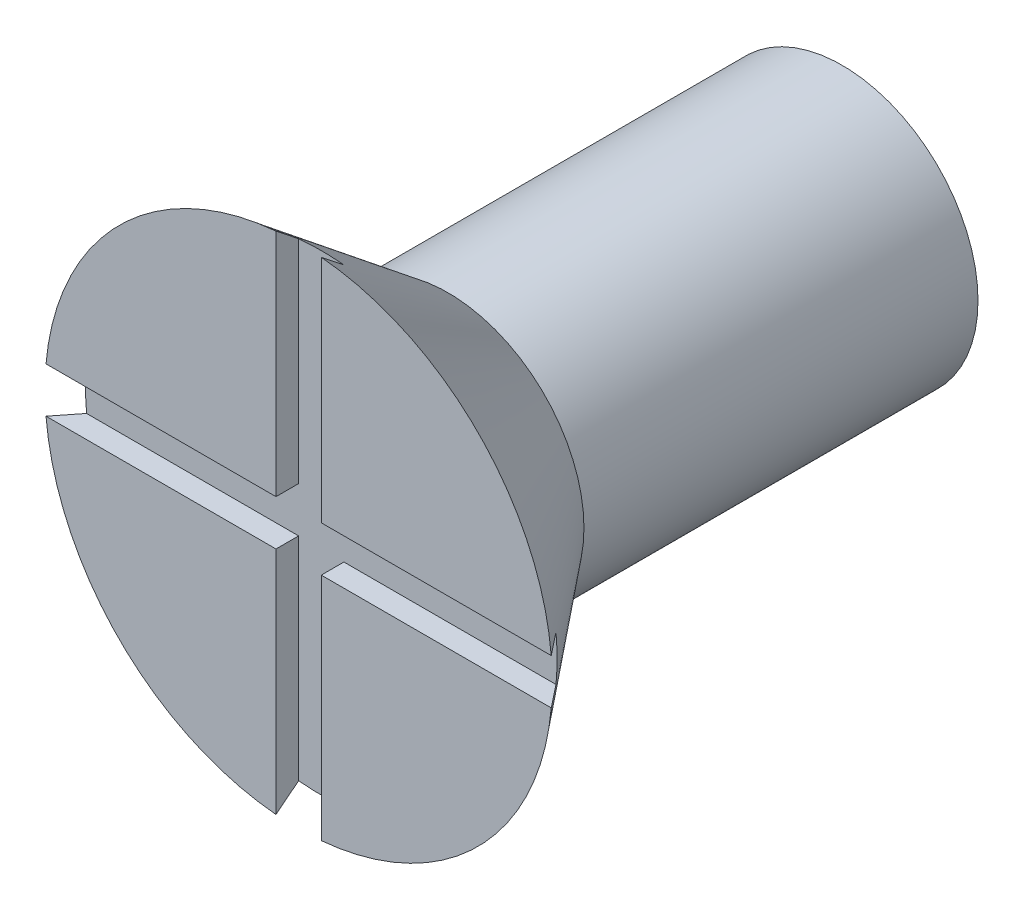
ISO-10303-21;
HEADER;
FILE_DESCRIPTION(('STEP AP214'),'2;1');
FILE_NAME('part.step','',(''),(''),'','','');
FILE_SCHEMA(('AUTOMOTIVE_DESIGN { 1 0 10303 214 1 1 1 1 }'));
ENDSEC;
DATA;
#1=APPLICATION_CONTEXT('core data for automotive mechanical design processes');
#2=APPLICATION_PROTOCOL_DEFINITION('international standard','automotive_design',2000,#1);
#3=PRODUCT_CONTEXT('',#1,'mechanical');
#4=PRODUCT('Part','Part','',(#3));
#5=PRODUCT_RELATED_PRODUCT_CATEGORY('part','',(#4));
#6=PRODUCT_DEFINITION_FORMATION('','',#4);
#7=PRODUCT_DEFINITION_CONTEXT('part definition',#1,'design');
#8=PRODUCT_DEFINITION('design','',#6,#7);
#9=PRODUCT_DEFINITION_SHAPE('','',#8);
#10=(LENGTH_UNIT() NAMED_UNIT(*) SI_UNIT(.MILLI.,.METRE.));
#11=(NAMED_UNIT(*) PLANE_ANGLE_UNIT() SI_UNIT($,.RADIAN.));
#12=(NAMED_UNIT(*) SI_UNIT($,.STERADIAN.) SOLID_ANGLE_UNIT());
#13=UNCERTAINTY_MEASURE_WITH_UNIT(LENGTH_MEASURE(1.E-05),#10,'distance_accuracy_value','');
#14=(GEOMETRIC_REPRESENTATION_CONTEXT(3) GLOBAL_UNCERTAINTY_ASSIGNED_CONTEXT((#13)) GLOBAL_UNIT_ASSIGNED_CONTEXT((#10,
#11,#12)) REPRESENTATION_CONTEXT('',''));
#15=CARTESIAN_POINT('',(0.,0.,0.));
#16=DIRECTION('',(0.,0.,1.));
#17=DIRECTION('',(1.,0.,0.));
#18=AXIS2_PLACEMENT_3D('',#15,#16,#17);
#19=CARTESIAN_POINT('',(0.,0.,0.));
#20=DIRECTION('',(0.,0.,-1.));
#21=DIRECTION('',(-1.,0.,0.));
#22=AXIS2_PLACEMENT_3D('',#19,#20,#21);
#23=PLANE('',#22);
#24=DIRECTION('',(1.,0.,0.));
#25=VECTOR('',#24,1.);
#26=CARTESIAN_POINT('',(0.,0.25,0.));
#27=LINE('',#26,#25);
#28=CARTESIAN_POINT('',(-2.78881695347687,0.25,0.));
#29=VERTEX_POINT('',#28);
#30=CARTESIAN_POINT('',(-0.25,0.25,0.));
#31=VERTEX_POINT('',#30);
#32=EDGE_CURVE('E175',#29,#31,#27,.T.);
#33=ORIENTED_EDGE('',*,*,#32,.T.);
#34=DIRECTION('',(0.,-1.,0.));
#35=VECTOR('',#34,1.);
#36=CARTESIAN_POINT('',(-0.25,-6.30142135623731,0.));
#37=LINE('',#36,#35);
#38=CARTESIAN_POINT('',(-0.25,2.78881695347687,0.));
#39=VERTEX_POINT('',#38);
#40=EDGE_CURVE('E172',#39,#31,#37,.T.);
#41=ORIENTED_EDGE('',*,*,#40,.F.);
#42=CARTESIAN_POINT('',(0.,0.,0.));
#43=DIRECTION('',(0.,0.,1.));
#44=DIRECTION('',(1.,0.,0.));
#45=AXIS2_PLACEMENT_3D('',#42,#43,#44);
#46=CIRCLE('',#45,2.8);
#47=EDGE_CURVE('E197',#39,#29,#46,.T.);
#48=ORIENTED_EDGE('',*,*,#47,.T.);
#49=EDGE_LOOP('',(#33,#41,#48));
#50=FACE_BOUND('',#49,.T.);
#51=ADVANCED_FACE('F34',(#50),#23,.F.);
#52=DIRECTION('',(0.,-1.,0.));
#53=VECTOR('',#52,1.);
#54=CARTESIAN_POINT('',(0.25,-6.30142135623731,0.));
#55=LINE('',#54,#53);
#56=CARTESIAN_POINT('',(0.25,2.78881695347687,0.));
#57=VERTEX_POINT('',#56);
#58=CARTESIAN_POINT('',(0.25,0.25,0.));
#59=VERTEX_POINT('',#58);
#60=EDGE_CURVE('E169',#57,#59,#55,.T.);
#61=ORIENTED_EDGE('',*,*,#60,.T.);
#62=DIRECTION('',(1.,0.,0.));
#63=VECTOR('',#62,1.);
#64=CARTESIAN_POINT('',(0.,0.25,0.));
#65=LINE('',#64,#63);
#66=CARTESIAN_POINT('',(2.78881695347687,0.25,0.));
#67=VERTEX_POINT('',#66);
#68=EDGE_CURVE('E166',#59,#67,#65,.T.);
#69=ORIENTED_EDGE('',*,*,#68,.T.);
#70=EDGE_CURVE('E194',#67,#57,#46,.T.);
#71=ORIENTED_EDGE('',*,*,#70,.T.);
#72=EDGE_LOOP('',(#61,#69,#71));
#73=FACE_BOUND('',#72,.T.);
#74=ADVANCED_FACE('F288',(#73),#23,.F.);
#75=DIRECTION('',(0.,-1.,0.));
#76=VECTOR('',#75,1.);
#77=CARTESIAN_POINT('',(0.25,-6.30142135623731,0.));
#78=LINE('',#77,#76);
#79=CARTESIAN_POINT('',(0.25,-0.25,0.));
#80=VERTEX_POINT('',#79);
#81=CARTESIAN_POINT('',(0.25,-2.78881695347687,0.));
#82=VERTEX_POINT('',#81);
#83=EDGE_CURVE('E134',#80,#82,#78,.T.);
#84=ORIENTED_EDGE('',*,*,#83,.T.);
#85=CARTESIAN_POINT('',(2.78881695347687,-0.25,0.));
#86=VERTEX_POINT('',#85);
#87=EDGE_CURVE('E193',#82,#86,#46,.T.);
#88=ORIENTED_EDGE('',*,*,#87,.T.);
#89=DIRECTION('',(1.,0.,0.));
#90=VECTOR('',#89,1.);
#91=CARTESIAN_POINT('',(0.,-0.25,0.));
#92=LINE('',#91,#90);
#93=EDGE_CURVE('E164',#80,#86,#92,.T.);
#94=ORIENTED_EDGE('',*,*,#93,.F.);
#95=EDGE_LOOP('',(#84,#88,#94));
#96=FACE_BOUND('',#95,.T.);
#97=ADVANCED_FACE('F308',(#96),#23,.F.);
#98=CARTESIAN_POINT('',(0.,0.,-1.65));
#99=DIRECTION('',(0.,0.,1.));
#100=DIRECTION('',(1.,0.,0.));
#101=AXIS2_PLACEMENT_3D('',#98,#99,#100);
#102=CONICAL_SURFACE('',#101,1.5,0.667306134978355);
#103=CARTESIAN_POINT('',(0.,0.,-1.65));
#104=DIRECTION('',(0.,0.,1.));
#105=DIRECTION('',(1.,0.,0.));
#106=AXIS2_PLACEMENT_3D('',#103,#104,#105);
#107=CIRCLE('',#106,1.5);
#108=CARTESIAN_POINT('',(1.5,0.,-1.65));
#109=VERTEX_POINT('',#108);
#110=EDGE_CURVE('E190',#109,#109,#107,.T.);
#111=ORIENTED_EDGE('',*,*,#110,.T.);
#112=EDGE_LOOP('',(#111));
#113=FACE_BOUND('',#112,.T.);
#114=ORIENTED_EDGE('',*,*,#47,.F.);
#115=CARTESIAN_POINT('',(-0.25,4.61040311921455,2.30641606433277));
#116=CARTESIAN_POINT('',(-0.25,4.44346195722325,2.0948429538878));
#117=CARTESIAN_POINT('',(-0.25,4.27650709341861,1.88328064952671));
#118=CARTESIAN_POINT('',(-0.25,3.94255134450841,1.46019424557198));
#119=CARTESIAN_POINT('',(-0.25,3.77555045965949,1.24867014577575));
#120=CARTESIAN_POINT('',(-0.25,3.44148518754161,0.825678179662706));
#121=CARTESIAN_POINT('',(-0.25,3.27442080145119,0.614210312415257));
#122=CARTESIAN_POINT('',(-0.25,2.94018648593002,0.191356170498895));
#123=CARTESIAN_POINT('',(-0.25,2.77301655594174,-0.0200301037293367));
#124=CARTESIAN_POINT('',(-0.25,2.43849855264865,-0.442673667390637));
#125=CARTESIAN_POINT('',(-0.25,2.27115047336071,-0.653930952090944));
#126=CARTESIAN_POINT('',(-0.25,2.01988138234541,-0.97061823218805));
#127=CARTESIAN_POINT('',(-0.25,1.93608452057686,-1.07614671698217));
#128=CARTESIAN_POINT('',(-0.25,1.76836741455764,-1.28710662423912));
#129=CARTESIAN_POINT('',(-0.25,1.68444716960416,-1.39253804614346));
#130=CARTESIAN_POINT('',(-0.25,1.51641370214706,-1.60325589296984));
#131=CARTESIAN_POINT('',(-0.25,1.4323004699463,-1.70854231016065));
#132=CARTESIAN_POINT('',(-0.25,1.26376822273576,-1.91886775746895));
#133=CARTESIAN_POINT('',(-0.25,1.17934921270972,-2.0239067915728));
#134=CARTESIAN_POINT('',(-0.25,1.05228987763816,-2.18112359389158));
#135=CARTESIAN_POINT('',(-0.25,1.00986345951116,-2.23347407582134));
#136=CARTESIAN_POINT('',(-0.25,0.92480036738101,-2.3380029174993));
#137=CARTESIAN_POINT('',(-0.25,0.882163695818334,-2.39018127923368));
#138=CARTESIAN_POINT('',(-0.25,0.796584348793626,-2.49429292306812));
#139=CARTESIAN_POINT('',(-0.25,0.753641654688421,-2.54622618991081));
#140=CARTESIAN_POINT('',(-0.25,0.667227301357165,-2.64965376649044));
#141=CARTESIAN_POINT('',(-0.25,0.623755620214092,-2.70114805788837));
#142=CARTESIAN_POINT('',(-0.25,0.579908440244512,-2.75232536636958));
#143=B_SPLINE_CURVE_WITH_KNOTS('',3,(#115,#116,#117,#118,#119,#120,#121,#122,#123,#124,#125,
#126,#127,#128,#129,#130,#131,#132,#133,#134,#135,#136,#137,#138,#139,#140,#141,#142),
.UNSPECIFIED.,.F.,.F.,(4,2,2,2,2,2,2,2,2,2,2,2,2,4),(0.,0.808512709901789,1.61702099865428,
2.42551495078849,3.23401321013757,4.04253953823131,4.44679630595397,4.85105538539298,
5.25533524335092,5.6596085415139,5.86175944247296,6.06390800251276,6.26606898473887,
6.46823837162429),.UNSPECIFIED.);
#144=CARTESIAN_POINT('',(-0.25,2.59099725173417,-0.25));
#145=VERTEX_POINT('',#144);
#146=EDGE_CURVE('E11',#39,#145,#143,.T.);
#147=ORIENTED_EDGE('',*,*,#146,.T.);
#148=CARTESIAN_POINT('',(0.,0.,-0.25));
#149=DIRECTION('',(0.,0.,1.));
#150=DIRECTION('',(1.,0.,0.));
#151=AXIS2_PLACEMENT_3D('',#148,#149,#150);
#152=CIRCLE('',#151,2.6030303030303);
#153=CARTESIAN_POINT('',(0.25,2.59099725173417,-0.25));
#154=VERTEX_POINT('',#153);
#155=EDGE_CURVE('E199',#154,#145,#152,.T.);
#156=ORIENTED_EDGE('',*,*,#155,.F.);
#157=CARTESIAN_POINT('',(0.25,4.61040311921455,2.30641606433277));
#158=CARTESIAN_POINT('',(0.25,4.44346195722325,2.0948429538878));
#159=CARTESIAN_POINT('',(0.25,4.27650709341861,1.88328064952671));
#160=CARTESIAN_POINT('',(0.25,3.94255134450841,1.46019424557198));
#161=CARTESIAN_POINT('',(0.25,3.77555045965949,1.24867014577575));
#162=CARTESIAN_POINT('',(0.25,3.44148518754161,0.825678179662706));
#163=CARTESIAN_POINT('',(0.25,3.27442080145119,0.614210312415257));
#164=CARTESIAN_POINT('',(0.25,2.94018648593002,0.191356170498895));
#165=CARTESIAN_POINT('',(0.25,2.77301655594174,-0.0200301037293367));
#166=CARTESIAN_POINT('',(0.25,2.43849855264865,-0.442673667390637));
#167=CARTESIAN_POINT('',(0.25,2.27115047336071,-0.653930952090944));
#168=CARTESIAN_POINT('',(0.25,2.01988138234541,-0.97061823218805));
#169=CARTESIAN_POINT('',(0.25,1.93608452057686,-1.07614671698217));
#170=CARTESIAN_POINT('',(0.25,1.76836741455764,-1.28710662423912));
#171=CARTESIAN_POINT('',(0.25,1.68444716960416,-1.39253804614346));
#172=CARTESIAN_POINT('',(0.25,1.51641370214706,-1.60325589296984));
#173=CARTESIAN_POINT('',(0.25,1.4323004699463,-1.70854231016065));
#174=CARTESIAN_POINT('',(0.25,1.26376822273576,-1.91886775746895));
#175=CARTESIAN_POINT('',(0.25,1.17934921270972,-2.0239067915728));
#176=CARTESIAN_POINT('',(0.25,1.05228987763816,-2.18112359389158));
#177=CARTESIAN_POINT('',(0.25,1.00986345951116,-2.23347407582134));
#178=CARTESIAN_POINT('',(0.25,0.92480036738101,-2.3380029174993));
#179=CARTESIAN_POINT('',(0.25,0.882163695818334,-2.39018127923368));
#180=CARTESIAN_POINT('',(0.25,0.796584348793626,-2.49429292306812));
#181=CARTESIAN_POINT('',(0.25,0.753641654688421,-2.54622618991081));
#182=CARTESIAN_POINT('',(0.25,0.667227301357165,-2.64965376649044));
#183=CARTESIAN_POINT('',(0.25,0.623755620214092,-2.70114805788837));
#184=CARTESIAN_POINT('',(0.25,0.579908440244512,-2.75232536636958));
#185=B_SPLINE_CURVE_WITH_KNOTS('',3,(#157,#158,#159,#160,#161,#162,#163,#164,#165,#166,#167,
#168,#169,#170,#171,#172,#173,#174,#175,#176,#177,#178,#179,#180,#181,#182,#183,#184),
.UNSPECIFIED.,.F.,.F.,(4,2,2,2,2,2,2,2,2,2,2,2,2,4),(0.,0.808512709901789,1.61702099865428,
2.42551495078849,3.23401321013757,4.04253953823131,4.44679630595397,4.85105538539298,
5.25533524335092,5.6596085415139,5.86175944247296,6.06390800251276,6.26606898473887,
6.46823837162429),.UNSPECIFIED.);
#186=EDGE_CURVE('E47',#57,#154,#185,.T.);
#187=ORIENTED_EDGE('',*,*,#186,.F.);
#188=ORIENTED_EDGE('',*,*,#70,.F.);
#189=CARTESIAN_POINT('',(0.579908440244512,0.25,-2.75232536636958));
#190=CARTESIAN_POINT('',(0.622223902543749,0.25,-2.70294133405472));
#191=CARTESIAN_POINT('',(0.664186326603089,0.25,-2.6532590896929));
#192=CARTESIAN_POINT('',(0.747610336936358,0.25,-2.55347895321281));
#193=CARTESIAN_POINT('',(0.789071944911312,0.25,-2.50338107926415));
#194=CARTESIAN_POINT('',(0.871700764541476,0.25,-2.40294910136923));
#195=CARTESIAN_POINT('',(0.912867993449845,0.25,-2.35261501155845));
#196=CARTESIAN_POINT('',(0.994997507765702,0.25,-2.2517787653431));
#197=CARTESIAN_POINT('',(1.03595979039282,0.25,-2.20127660667386));
#198=CARTESIAN_POINT('',(1.2054534374206,0.25,-1.99173767460425));
#199=CARTESIAN_POINT('',(1.33338451483848,0.25,-1.83221596540128));
#200=CARTESIAN_POINT('',(1.58871778630435,0.25,-1.51275147375573));
#201=CARTESIAN_POINT('',(1.7161199800947,0.25,-1.35280869110807));
#202=CARTESIAN_POINT('',(1.97065095405093,0.25,-1.03268330437289));
#203=CARTESIAN_POINT('',(2.09777970998038,0.25,-0.872500681001518));
#204=CARTESIAN_POINT('',(2.35187604577092,0.25,-0.552008167591453));
#205=CARTESIAN_POINT('',(2.47884362587265,0.25,-0.391698277743345));
#206=CARTESIAN_POINT('',(2.7730302315297,0.25,-0.0200151894947959));
#207=CARTESIAN_POINT('',(2.94021185622354,0.25,0.191387614041437));
#208=CARTESIAN_POINT('',(3.27447158883412,0.25,0.614275219241529));
#209=CARTESIAN_POINT('',(3.44154969668944,0.25,0.825760020953915));
#210=CARTESIAN_POINT('',(3.77561613667801,0.25,1.24875314567926));
#211=CARTESIAN_POINT('',(3.94260447801655,0.25,1.46026146142238));
#212=CARTESIAN_POINT('',(4.27653410896808,0.25,1.88331497361918));
#213=CARTESIAN_POINT('',(4.4434753986166,0.25,2.09486017004481));
#214=CARTESIAN_POINT('',(4.61040311921455,0.25,2.30641606433277));
#215=B_SPLINE_CURVE_WITH_KNOTS('',3,(#189,#190,#191,#192,#193,#194,#195,#196,#197,#198,#199,
#200,#201,#202,#203,#204,#205,#206,#207,#208,#209,#210,#211,#212,#213,#214),.UNSPECIFIED.,.F.,
.F.,(4,2,2,2,2,2,2,2,2,2,2,2,4),(0.,0.195094841528163,0.390181198790872,0.58525602701919,
0.780333494562499,1.39378015989668,2.00722712404542,2.62072638876302,3.23422473646537,
4.04278360528528,4.85134295335149,5.65979075598998,6.46823794660048),.UNSPECIFIED.);
#216=CARTESIAN_POINT('',(2.59099725173417,0.25,-0.25));
#217=VERTEX_POINT('',#216);
#218=EDGE_CURVE('E206',#217,#67,#215,.T.);
#219=ORIENTED_EDGE('',*,*,#218,.F.);
#220=CARTESIAN_POINT('',(2.59099725173417,-0.25,-0.25));
#221=VERTEX_POINT('',#220);
#222=EDGE_CURVE('E59',#221,#217,#152,.T.);
#223=ORIENTED_EDGE('',*,*,#222,.F.);
#224=CARTESIAN_POINT('',(0.579908440244512,-0.25,-2.75232536636958));
#225=CARTESIAN_POINT('',(0.622223902543749,-0.25,-2.70294133405472));
#226=CARTESIAN_POINT('',(0.664186326603089,-0.25,-2.6532590896929));
#227=CARTESIAN_POINT('',(0.747610336936358,-0.25,-2.55347895321281));
#228=CARTESIAN_POINT('',(0.789071944911312,-0.25,-2.50338107926415));
#229=CARTESIAN_POINT('',(0.871700764541476,-0.25,-2.40294910136923));
#230=CARTESIAN_POINT('',(0.912867993449845,-0.25,-2.35261501155845));
#231=CARTESIAN_POINT('',(0.994997507765702,-0.25,-2.2517787653431));
#232=CARTESIAN_POINT('',(1.03595979039282,-0.25,-2.20127660667386));
#233=CARTESIAN_POINT('',(1.2054534374206,-0.25,-1.99173767460425));
#234=CARTESIAN_POINT('',(1.33338451483848,-0.25,-1.83221596540128));
#235=CARTESIAN_POINT('',(1.58871778630435,-0.25,-1.51275147375573));
#236=CARTESIAN_POINT('',(1.7161199800947,-0.25,-1.35280869110807));
#237=CARTESIAN_POINT('',(1.97065095405093,-0.25,-1.03268330437289));
#238=CARTESIAN_POINT('',(2.09777970998038,-0.25,-0.872500681001518));
#239=CARTESIAN_POINT('',(2.35187604577092,-0.25,-0.552008167591453));
#240=CARTESIAN_POINT('',(2.47884362587265,-0.25,-0.391698277743345));
#241=CARTESIAN_POINT('',(2.7730302315297,-0.25,-0.0200151894947959));
#242=CARTESIAN_POINT('',(2.94021185622354,-0.25,0.191387614041437));
#243=CARTESIAN_POINT('',(3.27447158883412,-0.25,0.614275219241529));
#244=CARTESIAN_POINT('',(3.44154969668944,-0.25,0.825760020953915));
#245=CARTESIAN_POINT('',(3.77561613667801,-0.25,1.24875314567926));
#246=CARTESIAN_POINT('',(3.94260447801655,-0.25,1.46026146142238));
#247=CARTESIAN_POINT('',(4.27653410896808,-0.25,1.88331497361918));
#248=CARTESIAN_POINT('',(4.4434753986166,-0.25,2.09486017004481));
#249=CARTESIAN_POINT('',(4.61040311921455,-0.25,2.30641606433277));
#250=B_SPLINE_CURVE_WITH_KNOTS('',3,(#224,#225,#226,#227,#228,#229,#230,#231,#232,#233,#234,
#235,#236,#237,#238,#239,#240,#241,#242,#243,#244,#245,#246,#247,#248,#249),.UNSPECIFIED.,.F.,
.F.,(4,2,2,2,2,2,2,2,2,2,2,2,4),(0.,0.195094841528163,0.390181198790872,0.58525602701919,
0.780333494562499,1.39378015989668,2.00722712404542,2.62072638876302,3.23422473646537,
4.04278360528528,4.85134295335149,5.65979075598998,6.46823794660048),.UNSPECIFIED.);
#251=EDGE_CURVE('E148',#221,#86,#250,.T.);
#252=ORIENTED_EDGE('',*,*,#251,.T.);
#253=ORIENTED_EDGE('',*,*,#87,.F.);
#254=CARTESIAN_POINT('',(0.25,-0.579908440244512,-2.75232536636958));
#255=CARTESIAN_POINT('',(0.25,-0.622223902543749,-2.70294133405472));
#256=CARTESIAN_POINT('',(0.25,-0.664186326603089,-2.6532590896929));
#257=CARTESIAN_POINT('',(0.25,-0.747610336936358,-2.55347895321281));
#258=CARTESIAN_POINT('',(0.25,-0.789071944911313,-2.50338107926415));
#259=CARTESIAN_POINT('',(0.25,-0.871700764541476,-2.40294910136923));
#260=CARTESIAN_POINT('',(0.25,-0.912867993449845,-2.35261501155845));
#261=CARTESIAN_POINT('',(0.25,-0.994997507765702,-2.2517787653431));
#262=CARTESIAN_POINT('',(0.25,-1.03595979039282,-2.20127660667386));
#263=CARTESIAN_POINT('',(0.25,-1.2054534374206,-1.99173767460425));
#264=CARTESIAN_POINT('',(0.25,-1.33338451483848,-1.83221596540128));
#265=CARTESIAN_POINT('',(0.25,-1.58871778630435,-1.51275147375573));
#266=CARTESIAN_POINT('',(0.25,-1.7161199800947,-1.35280869110807));
#267=CARTESIAN_POINT('',(0.25,-1.97065095405093,-1.03268330437289));
#268=CARTESIAN_POINT('',(0.25,-2.09777970998038,-0.872500681001518));
#269=CARTESIAN_POINT('',(0.25,-2.35187604577092,-0.552008167591453));
#270=CARTESIAN_POINT('',(0.25,-2.47884362587265,-0.391698277743345));
#271=CARTESIAN_POINT('',(0.25,-2.7730302315297,-0.0200151894947961));
#272=CARTESIAN_POINT('',(0.25,-2.94021185622354,0.191387614041437));
#273=CARTESIAN_POINT('',(0.25,-3.27447158883412,0.614275219241528));
#274=CARTESIAN_POINT('',(0.25,-3.44154969668943,0.825760020953914));
#275=CARTESIAN_POINT('',(0.25,-3.77561613667801,1.24875314567926));
#276=CARTESIAN_POINT('',(0.25,-3.94260447801655,1.46026146142238));
#277=CARTESIAN_POINT('',(0.25,-4.27653410896808,1.88331497361918));
#278=CARTESIAN_POINT('',(0.25,-4.4434753986166,2.09486017004481));
#279=CARTESIAN_POINT('',(0.25,-4.61040311921455,2.30641606433277));
#280=B_SPLINE_CURVE_WITH_KNOTS('',3,(#254,#255,#256,#257,#258,#259,#260,#261,#262,#263,#264,
#265,#266,#267,#268,#269,#270,#271,#272,#273,#274,#275,#276,#277,#278,#279),.UNSPECIFIED.,.F.,
.F.,(4,2,2,2,2,2,2,2,2,2,2,2,4),(0.,0.195094841528163,0.390181198790872,0.585256027019191,
0.780333494562499,1.39378015989668,2.00722712404542,2.62072638876302,3.23422473646537,
4.04278360528528,4.85134295335149,5.65979075598998,6.46823794660048),.UNSPECIFIED.);
#281=CARTESIAN_POINT('',(0.25,-2.59099725173417,-0.25));
#282=VERTEX_POINT('',#281);
#283=EDGE_CURVE('E228',#282,#82,#280,.T.);
#284=ORIENTED_EDGE('',*,*,#283,.F.);
#285=CARTESIAN_POINT('',(-0.25,-2.59099725173417,-0.25));
#286=VERTEX_POINT('',#285);
#287=EDGE_CURVE('E143',#286,#282,#152,.T.);
#288=ORIENTED_EDGE('',*,*,#287,.F.);
#289=CARTESIAN_POINT('',(-0.25,-0.579908440244512,-2.75232536636958));
#290=CARTESIAN_POINT('',(-0.25,-0.622223902543749,-2.70294133405472));
#291=CARTESIAN_POINT('',(-0.25,-0.664186326603089,-2.6532590896929));
#292=CARTESIAN_POINT('',(-0.25,-0.747610336936358,-2.55347895321281));
#293=CARTESIAN_POINT('',(-0.25,-0.789071944911313,-2.50338107926415));
#294=CARTESIAN_POINT('',(-0.25,-0.871700764541476,-2.40294910136923));
#295=CARTESIAN_POINT('',(-0.25,-0.912867993449845,-2.35261501155845));
#296=CARTESIAN_POINT('',(-0.25,-0.994997507765702,-2.2517787653431));
#297=CARTESIAN_POINT('',(-0.25,-1.03595979039282,-2.20127660667386));
#298=CARTESIAN_POINT('',(-0.25,-1.2054534374206,-1.99173767460425));
#299=CARTESIAN_POINT('',(-0.25,-1.33338451483848,-1.83221596540128));
#300=CARTESIAN_POINT('',(-0.25,-1.58871778630435,-1.51275147375573));
#301=CARTESIAN_POINT('',(-0.25,-1.7161199800947,-1.35280869110807));
#302=CARTESIAN_POINT('',(-0.25,-1.97065095405093,-1.03268330437289));
#303=CARTESIAN_POINT('',(-0.25,-2.09777970998038,-0.872500681001518));
#304=CARTESIAN_POINT('',(-0.25,-2.35187604577092,-0.552008167591453));
#305=CARTESIAN_POINT('',(-0.25,-2.47884362587265,-0.391698277743345));
#306=CARTESIAN_POINT('',(-0.25,-2.7730302315297,-0.0200151894947958));
#307=CARTESIAN_POINT('',(-0.25,-2.94021185622354,0.191387614041437));
#308=CARTESIAN_POINT('',(-0.25,-3.27447158883412,0.614275219241528));
#309=CARTESIAN_POINT('',(-0.25,-3.44154969668944,0.825760020953915));
#310=CARTESIAN_POINT('',(-0.25,-3.77561613667801,1.24875314567926));
#311=CARTESIAN_POINT('',(-0.25,-3.94260447801655,1.46026146142238));
#312=CARTESIAN_POINT('',(-0.25,-4.27653410896808,1.88331497361918));
#313=CARTESIAN_POINT('',(-0.25,-4.4434753986166,2.09486017004481));
#314=CARTESIAN_POINT('',(-0.25,-4.61040311921455,2.30641606433277));
#315=B_SPLINE_CURVE_WITH_KNOTS('',3,(#289,#290,#291,#292,#293,#294,#295,#296,#297,#298,#299,
#300,#301,#302,#303,#304,#305,#306,#307,#308,#309,#310,#311,#312,#313,#314),.UNSPECIFIED.,.F.,
.F.,(4,2,2,2,2,2,2,2,2,2,2,2,4),(0.,0.195094841528163,0.390181198790872,0.58525602701919,
0.780333494562499,1.39378015989668,2.00722712404542,2.62072638876302,3.23422473646537,
4.04278360528528,4.85134295335149,5.65979075598998,6.46823794660048),.UNSPECIFIED.);
#316=CARTESIAN_POINT('',(-0.25,-2.78881695347687,0.));
#317=VERTEX_POINT('',#316);
#318=EDGE_CURVE('E235',#286,#317,#315,.T.);
#319=ORIENTED_EDGE('',*,*,#318,.T.);
#320=CARTESIAN_POINT('',(-2.78881695347687,-0.25,0.));
#321=VERTEX_POINT('',#320);
#322=EDGE_CURVE('E297',#321,#317,#46,.T.);
#323=ORIENTED_EDGE('',*,*,#322,.F.);
#324=CARTESIAN_POINT('',(-4.61040311921455,-0.25,2.30641606433277));
#325=CARTESIAN_POINT('',(-4.44346195722325,-0.25,2.0948429538878));
#326=CARTESIAN_POINT('',(-4.27650709341861,-0.25,1.88328064952671));
#327=CARTESIAN_POINT('',(-3.94255134450841,-0.25,1.46019424557198));
#328=CARTESIAN_POINT('',(-3.77555045965949,-0.25,1.24867014577575));
#329=CARTESIAN_POINT('',(-3.44148518754161,-0.25,0.825678179662706));
#330=CARTESIAN_POINT('',(-3.27442080145119,-0.25,0.614210312415257));
#331=CARTESIAN_POINT('',(-2.94018648593002,-0.25,0.191356170498895));
#332=CARTESIAN_POINT('',(-2.77301655594174,-0.25,-0.0200301037293367));
#333=CARTESIAN_POINT('',(-2.43849855264865,-0.25,-0.442673667390637));
#334=CARTESIAN_POINT('',(-2.27115047336071,-0.25,-0.653930952090944));
#335=CARTESIAN_POINT('',(-2.01988138234541,-0.25,-0.97061823218805));
#336=CARTESIAN_POINT('',(-1.93608452057686,-0.25,-1.07614671698217));
#337=CARTESIAN_POINT('',(-1.76836741455764,-0.25,-1.28710662423912));
#338=CARTESIAN_POINT('',(-1.68444716960416,-0.25,-1.39253804614346));
#339=CARTESIAN_POINT('',(-1.51641370214706,-0.25,-1.60325589296984));
#340=CARTESIAN_POINT('',(-1.4323004699463,-0.25,-1.70854231016065));
#341=CARTESIAN_POINT('',(-1.26376822273576,-0.25,-1.91886775746895));
#342=CARTESIAN_POINT('',(-1.17934921270973,-0.25,-2.0239067915728));
#343=CARTESIAN_POINT('',(-1.05228987763816,-0.25,-2.18112359389158));
#344=CARTESIAN_POINT('',(-1.00986345951116,-0.25,-2.23347407582134));
#345=CARTESIAN_POINT('',(-0.924800367381011,-0.25,-2.3380029174993));
#346=CARTESIAN_POINT('',(-0.882163695818335,-0.25,-2.39018127923368));
#347=CARTESIAN_POINT('',(-0.796584348793626,-0.25,-2.49429292306812));
#348=CARTESIAN_POINT('',(-0.753641654688421,-0.25,-2.54622618991081));
#349=CARTESIAN_POINT('',(-0.667227301357165,-0.25,-2.64965376649044));
#350=CARTESIAN_POINT('',(-0.623755620214092,-0.25,-2.70114805788837));
#351=CARTESIAN_POINT('',(-0.579908440244512,-0.25,-2.75232536636958));
#352=B_SPLINE_CURVE_WITH_KNOTS('',3,(#324,#325,#326,#327,#328,#329,#330,#331,#332,#333,#334,
#335,#336,#337,#338,#339,#340,#341,#342,#343,#344,#345,#346,#347,#348,#349,#350,#351),
.UNSPECIFIED.,.F.,.F.,(4,2,2,2,2,2,2,2,2,2,2,2,2,4),(0.,0.808512709901789,1.61702099865428,
2.42551495078849,3.23401321013757,4.04253953823131,4.44679630595397,4.85105538539298,
5.25533524335092,5.6596085415139,5.86175944247296,6.06390800251275,6.26606898473887,
6.46823837162429),.UNSPECIFIED.);
#353=CARTESIAN_POINT('',(-2.59099725173417,-0.25,-0.25));
#354=VERTEX_POINT('',#353);
#355=EDGE_CURVE('E248',#321,#354,#352,.T.);
#356=ORIENTED_EDGE('',*,*,#355,.T.);
#357=CARTESIAN_POINT('',(-2.59099725173417,0.25,-0.25));
#358=VERTEX_POINT('',#357);
#359=EDGE_CURVE('E234',#358,#354,#152,.T.);
#360=ORIENTED_EDGE('',*,*,#359,.F.);
#361=CARTESIAN_POINT('',(-4.61040311921455,0.25,2.30641606433277));
#362=CARTESIAN_POINT('',(-4.44346195722325,0.25,2.0948429538878));
#363=CARTESIAN_POINT('',(-4.27650709341861,0.25,1.88328064952671));
#364=CARTESIAN_POINT('',(-3.94255134450841,0.25,1.46019424557198));
#365=CARTESIAN_POINT('',(-3.77555045965949,0.25,1.24867014577575));
#366=CARTESIAN_POINT('',(-3.44148518754161,0.25,0.825678179662706));
#367=CARTESIAN_POINT('',(-3.27442080145119,0.25,0.614210312415257));
#368=CARTESIAN_POINT('',(-2.94018648593002,0.25,0.191356170498895));
#369=CARTESIAN_POINT('',(-2.77301655594174,0.25,-0.0200301037293367));
#370=CARTESIAN_POINT('',(-2.43849855264865,0.25,-0.442673667390637));
#371=CARTESIAN_POINT('',(-2.27115047336071,0.25,-0.653930952090944));
#372=CARTESIAN_POINT('',(-2.01988138234541,0.25,-0.97061823218805));
#373=CARTESIAN_POINT('',(-1.93608452057686,0.25,-1.07614671698217));
#374=CARTESIAN_POINT('',(-1.76836741455764,0.25,-1.28710662423912));
#375=CARTESIAN_POINT('',(-1.68444716960416,0.25,-1.39253804614346));
#376=CARTESIAN_POINT('',(-1.51641370214706,0.25,-1.60325589296984));
#377=CARTESIAN_POINT('',(-1.4323004699463,0.25,-1.70854231016065));
#378=CARTESIAN_POINT('',(-1.26376822273576,0.25,-1.91886775746895));
#379=CARTESIAN_POINT('',(-1.17934921270973,0.25,-2.0239067915728));
#380=CARTESIAN_POINT('',(-1.05228987763816,0.25,-2.18112359389158));
#381=CARTESIAN_POINT('',(-1.00986345951116,0.25,-2.23347407582134));
#382=CARTESIAN_POINT('',(-0.924800367381011,0.25,-2.3380029174993));
#383=CARTESIAN_POINT('',(-0.882163695818335,0.25,-2.39018127923368));
#384=CARTESIAN_POINT('',(-0.796584348793626,0.25,-2.49429292306812));
#385=CARTESIAN_POINT('',(-0.753641654688421,0.25,-2.54622618991081));
#386=CARTESIAN_POINT('',(-0.667227301357165,0.25,-2.64965376649044));
#387=CARTESIAN_POINT('',(-0.623755620214092,0.25,-2.70114805788837));
#388=CARTESIAN_POINT('',(-0.579908440244512,0.25,-2.75232536636958));
#389=B_SPLINE_CURVE_WITH_KNOTS('',3,(#361,#362,#363,#364,#365,#366,#367,#368,#369,#370,#371,
#372,#373,#374,#375,#376,#377,#378,#379,#380,#381,#382,#383,#384,#385,#386,#387,#388),
.UNSPECIFIED.,.F.,.F.,(4,2,2,2,2,2,2,2,2,2,2,2,2,4),(0.,0.808512709901789,1.61702099865428,
2.42551495078849,3.23401321013757,4.04253953823131,4.44679630595397,4.85105538539298,
5.25533524335092,5.6596085415139,5.86175944247296,6.06390800251275,6.26606898473887,
6.46823837162429),.UNSPECIFIED.);
#390=EDGE_CURVE('E241',#29,#358,#389,.T.);
#391=ORIENTED_EDGE('',*,*,#390,.F.);
#392=EDGE_LOOP('',(#114,#147,#156,#187,#188,#219,#223,#252,#253,#284,#288,#319,#323,#356,#360,#391));
#393=FACE_BOUND('',#392,.T.);
#394=ADVANCED_FACE('F213',(#113,#393),#102,.T.);
#395=ORIENTED_EDGE('',*,*,#322,.T.);
#396=DIRECTION('',(0.,-1.,0.));
#397=VECTOR('',#396,1.);
#398=CARTESIAN_POINT('',(-0.25,-6.30142135623731,0.));
#399=LINE('',#398,#397);
#400=CARTESIAN_POINT('',(-0.25,-0.25,0.));
#401=VERTEX_POINT('',#400);
#402=EDGE_CURVE('E144',#401,#317,#399,.T.);
#403=ORIENTED_EDGE('',*,*,#402,.F.);
#404=DIRECTION('',(1.,0.,0.));
#405=VECTOR('',#404,1.);
#406=CARTESIAN_POINT('',(0.,-0.25,0.));
#407=LINE('',#406,#405);
#408=EDGE_CURVE('E178',#321,#401,#407,.T.);
#409=ORIENTED_EDGE('',*,*,#408,.F.);
#410=EDGE_LOOP('',(#395,#403,#409));
#411=FACE_BOUND('',#410,.T.);
#412=ADVANCED_FACE('F36',(#411),#23,.F.);
#413=CARTESIAN_POINT('',(0.,0.,0.));
#414=DIRECTION('',(0.,0.,1.));
#415=DIRECTION('',(1.,0.,0.));
#416=AXIS2_PLACEMENT_3D('',#413,#414,#415);
#417=CYLINDRICAL_SURFACE('',#416,1.5);
#418=ORIENTED_EDGE('',*,*,#110,.F.);
#419=EDGE_LOOP('',(#418));
#420=FACE_BOUND('',#419,.T.);
#421=CARTESIAN_POINT('',(0.,0.,-6.));
#422=DIRECTION('',(0.,0.,1.));
#423=DIRECTION('',(1.,0.,0.));
#424=AXIS2_PLACEMENT_3D('',#421,#422,#423);
#425=CIRCLE('',#424,1.5);
#426=CARTESIAN_POINT('',(1.5,0.,-6.));
#427=VERTEX_POINT('',#426);
#428=EDGE_CURVE('E184',#427,#427,#425,.T.);
#429=ORIENTED_EDGE('',*,*,#428,.T.);
#430=EDGE_LOOP('',(#429));
#431=FACE_BOUND('',#430,.T.);
#432=ADVANCED_FACE('F316',(#420,#431),#417,.T.);
#433=CARTESIAN_POINT('',(0.,1.5,-6.));
#434=DIRECTION('',(0.,0.,1.));
#435=DIRECTION('',(1.,0.,0.));
#436=AXIS2_PLACEMENT_3D('',#433,#434,#435);
#437=PLANE('',#436);
#438=ORIENTED_EDGE('',*,*,#428,.F.);
#439=EDGE_LOOP('',(#438));
#440=FACE_BOUND('',#439,.T.);
#441=ADVANCED_FACE('F226',(#440),#437,.F.);
#442=CARTESIAN_POINT('',(0.25,-6.30142135623731,-0.25));
#443=DIRECTION('',(-1.,0.,0.));
#444=DIRECTION('',(0.,0.,1.));
#445=AXIS2_PLACEMENT_3D('',#442,#443,#444);
#446=PLANE('',#445);
#447=ORIENTED_EDGE('',*,*,#283,.T.);
#448=ORIENTED_EDGE('',*,*,#83,.F.);
#449=DIRECTION('',(0.,0.,1.));
#450=VECTOR('',#449,1.);
#451=CARTESIAN_POINT('',(0.25,-0.25,-0.25));
#452=LINE('',#451,#450);
#453=CARTESIAN_POINT('',(0.25,-0.25,-0.25));
#454=VERTEX_POINT('',#453);
#455=EDGE_CURVE('E129',#454,#80,#452,.T.);
#456=ORIENTED_EDGE('',*,*,#455,.F.);
#457=DIRECTION('',(0.,-1.,0.));
#458=VECTOR('',#457,1.);
#459=CARTESIAN_POINT('',(0.25,-6.30142135623731,-0.25));
#460=LINE('',#459,#458);
#461=EDGE_CURVE('E131',#454,#282,#460,.T.);
#462=ORIENTED_EDGE('',*,*,#461,.T.);
#463=EDGE_LOOP('',(#447,#448,#456,#462));
#464=FACE_BOUND('',#463,.T.);
#465=ADVANCED_FACE('F130',(#464),#446,.T.);
#466=CARTESIAN_POINT('',(-0.25,-6.30142135623731,-0.25));
#467=DIRECTION('',(-1.,0.,0.));
#468=DIRECTION('',(0.,-1.,0.));
#469=AXIS2_PLACEMENT_3D('',#466,#467,#468);
#470=PLANE('',#469);
#471=DIRECTION('',(0.,-1.,0.));
#472=VECTOR('',#471,1.);
#473=CARTESIAN_POINT('',(-0.25,-6.30142135623731,-0.25));
#474=LINE('',#473,#472);
#475=CARTESIAN_POINT('',(-0.25,-0.25,-0.25));
#476=VERTEX_POINT('',#475);
#477=EDGE_CURVE('E138',#476,#286,#474,.T.);
#478=ORIENTED_EDGE('',*,*,#477,.F.);
#479=DIRECTION('',(0.,0.,1.));
#480=VECTOR('',#479,1.);
#481=CARTESIAN_POINT('',(-0.25,-0.25,-0.25));
#482=LINE('',#481,#480);
#483=EDGE_CURVE('E182',#476,#401,#482,.T.);
#484=ORIENTED_EDGE('',*,*,#483,.T.);
#485=ORIENTED_EDGE('',*,*,#402,.T.);
#486=ORIENTED_EDGE('',*,*,#318,.F.);
#487=EDGE_LOOP('',(#478,#484,#485,#486));
#488=FACE_BOUND('',#487,.T.);
#489=ADVANCED_FACE('F225',(#488),#470,.F.);
#490=CARTESIAN_POINT('',(0.,-0.25,-0.25));
#491=DIRECTION('',(0.,-1.,0.));
#492=DIRECTION('',(0.,0.,-1.));
#493=AXIS2_PLACEMENT_3D('',#490,#491,#492);
#494=PLANE('',#493);
#495=ORIENTED_EDGE('',*,*,#408,.T.);
#496=ORIENTED_EDGE('',*,*,#483,.F.);
#497=DIRECTION('',(1.,0.,0.));
#498=VECTOR('',#497,1.);
#499=CARTESIAN_POINT('',(0.,-0.25,-0.25));
#500=LINE('',#499,#498);
#501=EDGE_CURVE('E160',#354,#476,#500,.T.);
#502=ORIENTED_EDGE('',*,*,#501,.F.);
#503=ORIENTED_EDGE('',*,*,#355,.F.);
#504=EDGE_LOOP('',(#495,#496,#502,#503));
#505=FACE_BOUND('',#504,.T.);
#506=ADVANCED_FACE('F258',(#505),#494,.F.);
#507=CARTESIAN_POINT('',(0.,0.25,-0.25));
#508=DIRECTION('',(0.,-1.,0.));
#509=DIRECTION('',(1.,0.,0.));
#510=AXIS2_PLACEMENT_3D('',#507,#508,#509);
#511=PLANE('',#510);
#512=ORIENTED_EDGE('',*,*,#390,.T.);
#513=DIRECTION('',(1.,0.,0.));
#514=VECTOR('',#513,1.);
#515=CARTESIAN_POINT('',(0.,0.25,-0.25));
#516=LINE('',#515,#514);
#517=CARTESIAN_POINT('',(-0.25,0.25,-0.25));
#518=VERTEX_POINT('',#517);
#519=EDGE_CURVE('E157',#358,#518,#516,.T.);
#520=ORIENTED_EDGE('',*,*,#519,.T.);
#521=DIRECTION('',(0.,0.,1.));
#522=VECTOR('',#521,1.);
#523=CARTESIAN_POINT('',(-0.25,0.25,-0.25));
#524=LINE('',#523,#522);
#525=EDGE_CURVE('E185',#518,#31,#524,.T.);
#526=ORIENTED_EDGE('',*,*,#525,.T.);
#527=ORIENTED_EDGE('',*,*,#32,.F.);
#528=EDGE_LOOP('',(#512,#520,#526,#527));
#529=FACE_BOUND('',#528,.T.);
#530=ADVANCED_FACE('F254',(#529),#511,.T.);
#531=CARTESIAN_POINT('',(-0.25,-6.30142135623731,-0.25));
#532=DIRECTION('',(-1.,0.,0.));
#533=DIRECTION('',(0.,-1.,0.));
#534=AXIS2_PLACEMENT_3D('',#531,#532,#533);
#535=PLANE('',#534);
#536=ORIENTED_EDGE('',*,*,#40,.T.);
#537=ORIENTED_EDGE('',*,*,#525,.F.);
#538=DIRECTION('',(0.,-1.,0.));
#539=VECTOR('',#538,1.);
#540=CARTESIAN_POINT('',(-0.25,-6.30142135623731,-0.25));
#541=LINE('',#540,#539);
#542=EDGE_CURVE('E155',#145,#518,#541,.T.);
#543=ORIENTED_EDGE('',*,*,#542,.F.);
#544=ORIENTED_EDGE('',*,*,#146,.F.);
#545=EDGE_LOOP('',(#536,#537,#543,#544));
#546=FACE_BOUND('',#545,.T.);
#547=ADVANCED_FACE('F257',(#546),#535,.F.);
#548=CARTESIAN_POINT('',(0.25,-6.30142135623731,-0.25));
#549=DIRECTION('',(-1.,0.,0.));
#550=DIRECTION('',(0.,0.,1.));
#551=AXIS2_PLACEMENT_3D('',#548,#549,#550);
#552=PLANE('',#551);
#553=ORIENTED_EDGE('',*,*,#186,.T.);
#554=DIRECTION('',(0.,-1.,0.));
#555=VECTOR('',#554,1.);
#556=CARTESIAN_POINT('',(0.25,-6.30142135623731,-0.25));
#557=LINE('',#556,#555);
#558=CARTESIAN_POINT('',(0.25,0.25,-0.25));
#559=VERTEX_POINT('',#558);
#560=EDGE_CURVE('E151',#154,#559,#557,.T.);
#561=ORIENTED_EDGE('',*,*,#560,.T.);
#562=DIRECTION('',(0.,0.,1.));
#563=VECTOR('',#562,1.);
#564=CARTESIAN_POINT('',(0.25,0.25,-0.25));
#565=LINE('',#564,#563);
#566=EDGE_CURVE('E137',#559,#59,#565,.T.);
#567=ORIENTED_EDGE('',*,*,#566,.T.);
#568=ORIENTED_EDGE('',*,*,#60,.F.);
#569=EDGE_LOOP('',(#553,#561,#567,#568));
#570=FACE_BOUND('',#569,.T.);
#571=ADVANCED_FACE('F263',(#570),#552,.T.);
#572=CARTESIAN_POINT('',(0.,0.25,-0.25));
#573=DIRECTION('',(0.,-1.,0.));
#574=DIRECTION('',(1.,0.,0.));
#575=AXIS2_PLACEMENT_3D('',#572,#573,#574);
#576=PLANE('',#575);
#577=ORIENTED_EDGE('',*,*,#218,.T.);
#578=ORIENTED_EDGE('',*,*,#68,.F.);
#579=ORIENTED_EDGE('',*,*,#566,.F.);
#580=DIRECTION('',(1.,0.,0.));
#581=VECTOR('',#580,1.);
#582=CARTESIAN_POINT('',(0.,0.25,-0.25));
#583=LINE('',#582,#581);
#584=EDGE_CURVE('E149',#559,#217,#583,.T.);
#585=ORIENTED_EDGE('',*,*,#584,.T.);
#586=EDGE_LOOP('',(#577,#578,#579,#585));
#587=FACE_BOUND('',#586,.T.);
#588=ADVANCED_FACE('F219',(#587),#576,.T.);
#589=CARTESIAN_POINT('',(0.,-0.25,-0.25));
#590=DIRECTION('',(0.,-1.,0.));
#591=DIRECTION('',(1.,0.,0.));
#592=AXIS2_PLACEMENT_3D('',#589,#590,#591);
#593=PLANE('',#592);
#594=DIRECTION('',(1.,0.,0.));
#595=VECTOR('',#594,1.);
#596=CARTESIAN_POINT('',(0.,-0.25,-0.25));
#597=LINE('',#596,#595);
#598=EDGE_CURVE('E54',#454,#221,#597,.T.);
#599=ORIENTED_EDGE('',*,*,#598,.F.);
#600=ORIENTED_EDGE('',*,*,#455,.T.);
#601=ORIENTED_EDGE('',*,*,#93,.T.);
#602=ORIENTED_EDGE('',*,*,#251,.F.);
#603=EDGE_LOOP('',(#599,#600,#601,#602));
#604=FACE_BOUND('',#603,.T.);
#605=ADVANCED_FACE('F146',(#604),#593,.F.);
#606=CARTESIAN_POINT('',(0.,-6.30142135623731,-0.25));
#607=DIRECTION('',(0.,0.,1.));
#608=DIRECTION('',(1.,0.,0.));
#609=AXIS2_PLACEMENT_3D('',#606,#607,#608);
#610=PLANE('',#609);
#611=ORIENTED_EDGE('',*,*,#155,.T.);
#612=ORIENTED_EDGE('',*,*,#542,.T.);
#613=ORIENTED_EDGE('',*,*,#519,.F.);
#614=ORIENTED_EDGE('',*,*,#359,.T.);
#615=ORIENTED_EDGE('',*,*,#501,.T.);
#616=ORIENTED_EDGE('',*,*,#477,.T.);
#617=ORIENTED_EDGE('',*,*,#287,.T.);
#618=ORIENTED_EDGE('',*,*,#461,.F.);
#619=ORIENTED_EDGE('',*,*,#598,.T.);
#620=ORIENTED_EDGE('',*,*,#222,.T.);
#621=ORIENTED_EDGE('',*,*,#584,.F.);
#622=ORIENTED_EDGE('',*,*,#560,.F.);
#623=EDGE_LOOP('',(#611,#612,#613,#614,#615,#616,#617,#618,#619,#620,#621,#622));
#624=FACE_BOUND('',#623,.T.);
#625=ADVANCED_FACE('F140',(#624),#610,.T.);
#626=CLOSED_SHELL('',(#51,#74,#97,#394,#412,#432,#441,#465,#489,#506,#530,#547,#571,#588,#605,#625));
#627=MANIFOLD_SOLID_BREP('B2',#626);
#628=ADVANCED_BREP_SHAPE_REPRESENTATION('',(#18,#627),#14);
#629=SHAPE_DEFINITION_REPRESENTATION(#9,#628);
ENDSEC;
END-ISO-10303-21;
